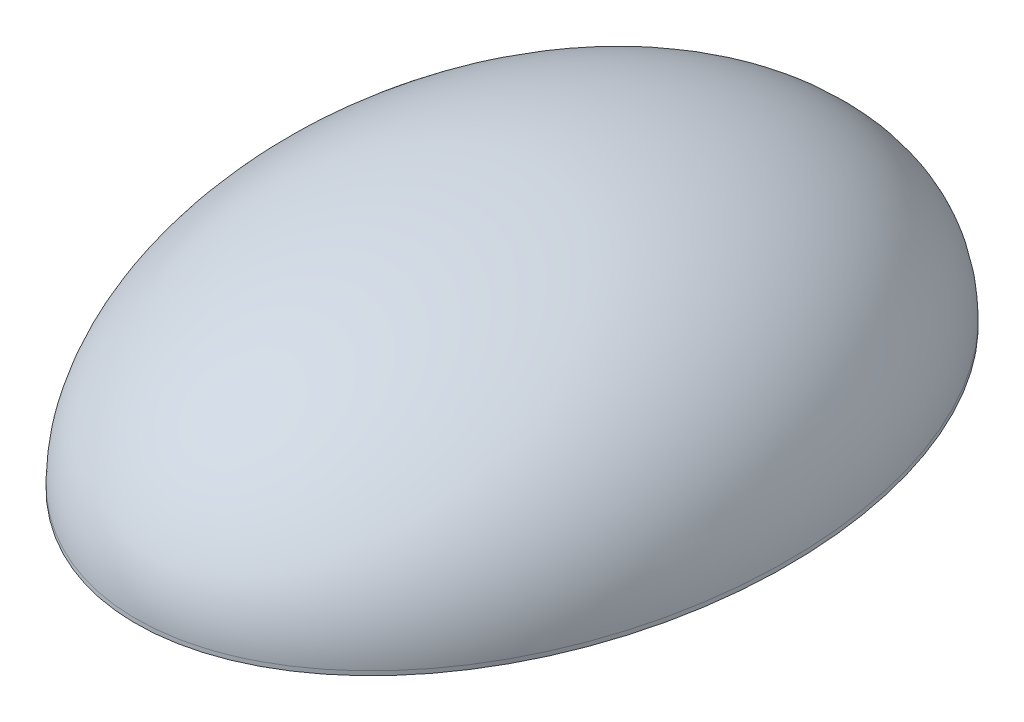
ISO-10303-21;
HEADER;
FILE_DESCRIPTION(('STEP AP214'),'2;1');
FILE_NAME('part.step','',(''),(''),'','','');
FILE_SCHEMA(('AUTOMOTIVE_DESIGN { 1 0 10303 214 1 1 1 1 }'));
ENDSEC;
DATA;
#1=APPLICATION_CONTEXT('core data for automotive mechanical design processes');
#2=APPLICATION_PROTOCOL_DEFINITION('international standard','automotive_design',2000,#1);
#3=PRODUCT_CONTEXT('',#1,'mechanical');
#4=PRODUCT('Part','Part','',(#3));
#5=PRODUCT_RELATED_PRODUCT_CATEGORY('part','',(#4));
#6=PRODUCT_DEFINITION_FORMATION('','',#4);
#7=PRODUCT_DEFINITION_CONTEXT('part definition',#1,'design');
#8=PRODUCT_DEFINITION('design','',#6,#7);
#9=PRODUCT_DEFINITION_SHAPE('','',#8);
#10=(LENGTH_UNIT() NAMED_UNIT(*) SI_UNIT(.MILLI.,.METRE.));
#11=(NAMED_UNIT(*) PLANE_ANGLE_UNIT() SI_UNIT($,.RADIAN.));
#12=(NAMED_UNIT(*) SI_UNIT($,.STERADIAN.) SOLID_ANGLE_UNIT());
#13=UNCERTAINTY_MEASURE_WITH_UNIT(LENGTH_MEASURE(1.E-05),#10,'distance_accuracy_value','');
#14=(GEOMETRIC_REPRESENTATION_CONTEXT(3) GLOBAL_UNCERTAINTY_ASSIGNED_CONTEXT((#13)) GLOBAL_UNIT_ASSIGNED_CONTEXT((#10,
#11,#12)) REPRESENTATION_CONTEXT('',''));
#15=CARTESIAN_POINT('',(0.,0.,0.));
#16=DIRECTION('',(0.,0.,1.));
#17=DIRECTION('',(1.,0.,0.));
#18=AXIS2_PLACEMENT_3D('',#15,#16,#17);
#19=CARTESIAN_POINT('',(0.,-0.1,0.));
#20=DIRECTION('',(0.,1.,0.));
#21=DIRECTION('',(0.,0.,-1.));
#22=AXIS2_PLACEMENT_3D('',#19,#20,#21);
#23=ELLIPSE('',#22,8.875,6.5);
#24=DIRECTION('',(0.,1.,0.));
#25=VECTOR('',#24,1.);
#26=SURFACE_OF_LINEAR_EXTRUSION('',#23,#25);
#27=CARTESIAN_POINT('',(0.,-0.1,-8.875));
#28=VERTEX_POINT('',#27);
#29=EDGE_CURVE('E11',#28,#28,#23,.T.);
#30=ORIENTED_EDGE('',*,*,#29,.T.);
#31=EDGE_LOOP('',(#30));
#32=FACE_BOUND('',#31,.T.);
#33=CARTESIAN_POINT('',(0.,0.,0.));
#34=DIRECTION('',(0.,1.,0.));
#35=DIRECTION('',(0.,0.,-1.));
#36=AXIS2_PLACEMENT_3D('',#33,#34,#35);
#37=ELLIPSE('',#36,8.875,6.5);
#38=CARTESIAN_POINT('',(0.,0.,-8.875));
#39=VERTEX_POINT('',#38);
#40=EDGE_CURVE('E41',#39,#39,#37,.T.);
#41=ORIENTED_EDGE('',*,*,#40,.F.);
#42=EDGE_LOOP('',(#41));
#43=FACE_BOUND('',#42,.T.);
#44=ADVANCED_FACE('F35',(#32,#43),#26,.T.);
#45=CARTESIAN_POINT('',(0.,-0.1,0.));
#46=DIRECTION('',(0.,1.,0.));
#47=DIRECTION('',(0.,0.,1.));
#48=AXIS2_PLACEMENT_3D('',#45,#46,#47);
#49=PLANE('',#48);
#50=ORIENTED_EDGE('',*,*,#29,.F.);
#51=EDGE_LOOP('',(#50));
#52=FACE_BOUND('',#51,.T.);
#53=ADVANCED_FACE('F49',(#52),#49,.F.);
#54=CARTESIAN_POINT('',(0.,0.,-8.875));
#55=CARTESIAN_POINT('',(0.,4.75,-8.875));
#56=CARTESIAN_POINT('',(0.,4.75,0.));
#57=CARTESIAN_POINT('',(-13.,0.,-8.875));
#58=CARTESIAN_POINT('',(-13.,4.75,-8.875));
#59=CARTESIAN_POINT('',(0.,4.75,0.));
#60=CARTESIAN_POINT('',(-13.,0.,8.875));
#61=CARTESIAN_POINT('',(-13.,4.75,8.875));
#62=CARTESIAN_POINT('',(0.,4.75,0.));
#63=CARTESIAN_POINT('',(0.,0.,8.875));
#64=CARTESIAN_POINT('',(0.,4.75,8.875));
#65=CARTESIAN_POINT('',(0.,4.75,0.));
#66=CARTESIAN_POINT('',(13.,0.,8.875));
#67=CARTESIAN_POINT('',(13.,4.75,8.875));
#68=CARTESIAN_POINT('',(0.,4.75,0.));
#69=CARTESIAN_POINT('',(13.,0.,-8.875));
#70=CARTESIAN_POINT('',(13.,4.75,-8.875));
#71=CARTESIAN_POINT('',(0.,4.75,0.));
#72=CARTESIAN_POINT('',(0.,0.,-8.875));
#73=CARTESIAN_POINT('',(0.,4.75,-8.875));
#74=CARTESIAN_POINT('',(0.,4.75,0.));
#75=(BOUNDED_SURFACE() B_SPLINE_SURFACE(3,2,((#54,#55,#56),(#57,#58,#59),(#60,#61,#62),(#63,#64,
#65),(#66,#67,#68),(#69,#70,#71),(#72,#73,#74)),.UNSPECIFIED.,.T.,.F.,
.F.) B_SPLINE_SURFACE_WITH_KNOTS((4,3,4),(3,3),(0.,0.5,1.),(0.,1.),
.UNSPECIFIED.) GEOMETRIC_REPRESENTATION_ITEM() RATIONAL_B_SPLINE_SURFACE(((1.,0.707106781186548,
1.),(0.333333333333333,0.235702260395516,0.333333333333333),(0.333333333333333,
0.235702260395516,0.333333333333333),(1.,0.707106781186548,1.),(0.333333333333333,
0.235702260395516,0.333333333333333),(0.333333333333333,0.235702260395516,0.333333333333333),
(1.,0.707106781186548,1.))) REPRESENTATION_ITEM('') SURFACE());
#76=CARTESIAN_POINT('',(0.,4.75,0.));
#77=VERTEX_POINT('',#76);
#78=VERTEX_LOOP('',#77);
#79=FACE_BOUND('',#78,.T.);
#80=ORIENTED_EDGE('',*,*,#40,.T.);
#81=EDGE_LOOP('',(#80));
#82=FACE_BOUND('',#81,.T.);
#83=ADVANCED_FACE('F37',(#79,#82),#75,.T.);
#84=CLOSED_SHELL('',(#44,#53,#83));
#85=MANIFOLD_SOLID_BREP('B2',#84);
#86=ADVANCED_BREP_SHAPE_REPRESENTATION('',(#18,#85),#14);
#87=SHAPE_DEFINITION_REPRESENTATION(#9,#86);
ENDSEC;
END-ISO-10303-21;
